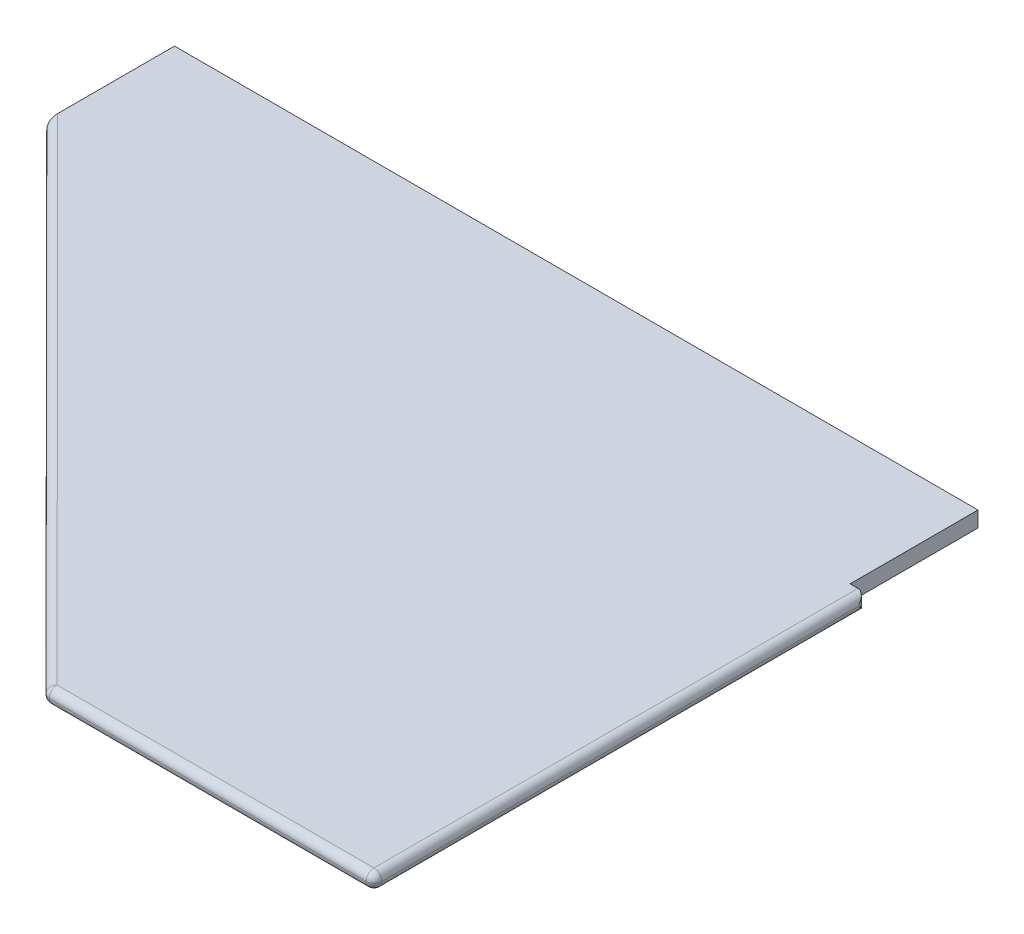
ISO-10303-21;
HEADER;
FILE_DESCRIPTION(('STEP AP214'),'2;1');
FILE_NAME('part.step','',(''),(''),'','','');
FILE_SCHEMA(('AUTOMOTIVE_DESIGN { 1 0 10303 214 1 1 1 1 }'));
ENDSEC;
DATA;
#1=APPLICATION_CONTEXT('core data for automotive mechanical design processes');
#2=APPLICATION_PROTOCOL_DEFINITION('international standard','automotive_design',2000,#1);
#3=PRODUCT_CONTEXT('',#1,'mechanical');
#4=PRODUCT('Part','Part','',(#3));
#5=PRODUCT_RELATED_PRODUCT_CATEGORY('part','',(#4));
#6=PRODUCT_DEFINITION_FORMATION('','',#4);
#7=PRODUCT_DEFINITION_CONTEXT('part definition',#1,'design');
#8=PRODUCT_DEFINITION('design','',#6,#7);
#9=PRODUCT_DEFINITION_SHAPE('','',#8);
#10=(LENGTH_UNIT() NAMED_UNIT(*) SI_UNIT(.MILLI.,.METRE.));
#11=(NAMED_UNIT(*) PLANE_ANGLE_UNIT() SI_UNIT($,.RADIAN.));
#12=(NAMED_UNIT(*) SI_UNIT($,.STERADIAN.) SOLID_ANGLE_UNIT());
#13=UNCERTAINTY_MEASURE_WITH_UNIT(LENGTH_MEASURE(1.E-05),#10,'distance_accuracy_value','');
#14=(GEOMETRIC_REPRESENTATION_CONTEXT(3) GLOBAL_UNCERTAINTY_ASSIGNED_CONTEXT((#13)) GLOBAL_UNIT_ASSIGNED_CONTEXT((#10,
#11,#12)) REPRESENTATION_CONTEXT('',''));
#15=CARTESIAN_POINT('',(0.,0.,0.));
#16=DIRECTION('',(0.,0.,1.));
#17=DIRECTION('',(1.,0.,0.));
#18=AXIS2_PLACEMENT_3D('',#15,#16,#17);
#19=CARTESIAN_POINT('',(0.,4.76,-150.));
#20=DIRECTION('',(0.,0.,1.));
#21=DIRECTION('',(1.,0.,0.));
#22=AXIS2_PLACEMENT_3D('',#19,#20,#21);
#23=PLANE('',#22);
#24=DIRECTION('',(-1.,0.,0.));
#25=VECTOR('',#24,1.);
#26=CARTESIAN_POINT('',(0.,4.76,-150.));
#27=LINE('',#26,#25);
#28=CARTESIAN_POINT('',(-2.38,4.76,-150.));
#29=VERTEX_POINT('',#28);
#30=CARTESIAN_POINT('',(-4.8006,4.76,-150.));
#31=VERTEX_POINT('',#30);
#32=EDGE_CURVE('E240',#29,#31,#27,.T.);
#33=ORIENTED_EDGE('',*,*,#32,.F.);
#34=DIRECTION('',(0.,-1.,0.));
#35=VECTOR('',#34,1.);
#36=CARTESIAN_POINT('',(-2.38,4.76,-150.));
#37=LINE('',#36,#35);
#38=CARTESIAN_POINT('',(-2.38,0.,-150.));
#39=VERTEX_POINT('',#38);
#40=EDGE_CURVE('E140',#29,#39,#37,.T.);
#41=ORIENTED_EDGE('',*,*,#40,.T.);
#42=DIRECTION('',(-1.,0.,0.));
#43=VECTOR('',#42,1.);
#44=CARTESIAN_POINT('',(0.,0.,-150.));
#45=LINE('',#44,#43);
#46=CARTESIAN_POINT('',(-4.8006,0.,-150.));
#47=VERTEX_POINT('',#46);
#48=EDGE_CURVE('E100',#39,#47,#45,.T.);
#49=ORIENTED_EDGE('',*,*,#48,.T.);
#50=DIRECTION('',(0.,-1.,0.));
#51=VECTOR('',#50,1.);
#52=CARTESIAN_POINT('',(-4.8006,4.76,-150.));
#53=LINE('',#52,#51);
#54=EDGE_CURVE('E249',#31,#47,#53,.T.);
#55=ORIENTED_EDGE('',*,*,#54,.F.);
#56=EDGE_LOOP('',(#33,#41,#49,#55));
#57=FACE_BOUND('',#56,.T.);
#58=ADVANCED_FACE('F45',(#57),#23,.F.);
#59=CARTESIAN_POINT('',(-4.8006,4.76,-150.));
#60=DIRECTION('',(-1.,0.,0.));
#61=DIRECTION('',(0.,0.,1.));
#62=AXIS2_PLACEMENT_3D('',#59,#60,#61);
#63=PLANE('',#62);
#64=DIRECTION('',(0.,0.,-1.));
#65=VECTOR('',#64,1.);
#66=CARTESIAN_POINT('',(-4.8006,0.,-150.));
#67=LINE('',#66,#65);
#68=CARTESIAN_POINT('',(-4.8006,0.,-188.989));
#69=VERTEX_POINT('',#68);
#70=EDGE_CURVE('E225',#47,#69,#67,.T.);
#71=ORIENTED_EDGE('',*,*,#70,.T.);
#72=DIRECTION('',(0.,-1.,0.));
#73=VECTOR('',#72,1.);
#74=CARTESIAN_POINT('',(-4.8006,4.76,-188.989));
#75=LINE('',#74,#73);
#76=CARTESIAN_POINT('',(-4.8006,4.76,-188.989));
#77=VERTEX_POINT('',#76);
#78=EDGE_CURVE('E245',#77,#69,#75,.T.);
#79=ORIENTED_EDGE('',*,*,#78,.F.);
#80=DIRECTION('',(0.,0.,-1.));
#81=VECTOR('',#80,1.);
#82=CARTESIAN_POINT('',(-4.8006,4.76,-150.));
#83=LINE('',#82,#81);
#84=EDGE_CURVE('E270',#31,#77,#83,.T.);
#85=ORIENTED_EDGE('',*,*,#84,.F.);
#86=ORIENTED_EDGE('',*,*,#54,.T.);
#87=EDGE_LOOP('',(#71,#79,#85,#86));
#88=FACE_BOUND('',#87,.T.);
#89=ADVANCED_FACE('F310',(#88),#63,.F.);
#90=CARTESIAN_POINT('',(-4.8006,4.76,-188.989));
#91=DIRECTION('',(0.,0.,1.));
#92=DIRECTION('',(1.,0.,0.));
#93=AXIS2_PLACEMENT_3D('',#90,#91,#92);
#94=PLANE('',#93);
#95=DIRECTION('',(-1.,0.,0.));
#96=VECTOR('',#95,1.);
#97=CARTESIAN_POINT('',(-4.8006,0.,-188.989));
#98=LINE('',#97,#96);
#99=CARTESIAN_POINT('',(-249.8006,0.,-188.989));
#100=VERTEX_POINT('',#99);
#101=EDGE_CURVE('E228',#69,#100,#98,.T.);
#102=ORIENTED_EDGE('',*,*,#101,.T.);
#103=DIRECTION('',(0.,-1.,0.));
#104=VECTOR('',#103,1.);
#105=CARTESIAN_POINT('',(-249.8006,4.76,-188.989));
#106=LINE('',#105,#104);
#107=CARTESIAN_POINT('',(-249.8006,4.76,-188.989));
#108=VERTEX_POINT('',#107);
#109=EDGE_CURVE('E241',#108,#100,#106,.T.);
#110=ORIENTED_EDGE('',*,*,#109,.F.);
#111=DIRECTION('',(-1.,0.,0.));
#112=VECTOR('',#111,1.);
#113=CARTESIAN_POINT('',(-4.8006,4.76,-188.989));
#114=LINE('',#113,#112);
#115=EDGE_CURVE('E304',#77,#108,#114,.T.);
#116=ORIENTED_EDGE('',*,*,#115,.F.);
#117=ORIENTED_EDGE('',*,*,#78,.T.);
#118=EDGE_LOOP('',(#102,#110,#116,#117));
#119=FACE_BOUND('',#118,.T.);
#120=ADVANCED_FACE('F301',(#119),#94,.F.);
#121=CARTESIAN_POINT('',(-249.8006,4.76,-188.989));
#122=DIRECTION('',(1.,0.,0.));
#123=DIRECTION('',(0.,0.,-1.));
#124=AXIS2_PLACEMENT_3D('',#121,#122,#123);
#125=PLANE('',#124);
#126=DIRECTION('',(0.,-1.,0.));
#127=VECTOR('',#126,1.);
#128=CARTESIAN_POINT('',(-249.8006,4.76,-150.984902060891));
#129=LINE('',#128,#127);
#130=CARTESIAN_POINT('',(-249.8006,0.698204429488853,-150.984902060891));
#131=VERTEX_POINT('',#130);
#132=CARTESIAN_POINT('',(-249.8006,4.06179557051116,-150.984902060891));
#133=VERTEX_POINT('',#132);
#134=EDGE_CURVE('E56',#131,#133,#129,.F.);
#135=ORIENTED_EDGE('',*,*,#134,.T.);
#136=CARTESIAN_POINT('',(-249.8006,2.38,-153.368066903802));
#137=DIRECTION('',(1.,0.,0.));
#138=DIRECTION('',(0.,0.,-1.));
#139=AXIS2_PLACEMENT_3D('',#136,#137,#138);
#140=ELLIPSE('',#139,3.36806690380236,2.38);
#141=CARTESIAN_POINT('',(-249.8006,4.76,-153.368066903802));
#142=VERTEX_POINT('',#141);
#143=EDGE_CURVE('E11',#133,#142,#140,.F.);
#144=ORIENTED_EDGE('',*,*,#143,.T.);
#145=DIRECTION('',(0.,0.,1.));
#146=VECTOR('',#145,1.);
#147=CARTESIAN_POINT('',(-249.8006,4.76,-188.989));
#148=LINE('',#147,#146);
#149=EDGE_CURVE('E231',#108,#142,#148,.T.);
#150=ORIENTED_EDGE('',*,*,#149,.F.);
#151=ORIENTED_EDGE('',*,*,#109,.T.);
#152=DIRECTION('',(0.,0.,1.));
#153=VECTOR('',#152,1.);
#154=CARTESIAN_POINT('',(-249.8006,0.,-188.989));
#155=LINE('',#154,#153);
#156=CARTESIAN_POINT('',(-249.8006,0.,-153.368066903802));
#157=VERTEX_POINT('',#156);
#158=EDGE_CURVE('E236',#100,#157,#155,.T.);
#159=ORIENTED_EDGE('',*,*,#158,.T.);
#160=CARTESIAN_POINT('',(-249.8006,2.38,-153.368066903802));
#161=DIRECTION('',(1.,0.,0.));
#162=DIRECTION('',(0.,0.,1.));
#163=AXIS2_PLACEMENT_3D('',#160,#161,#162);
#164=ELLIPSE('',#163,3.36806690380236,2.38);
#165=EDGE_CURVE('E175',#157,#131,#164,.F.);
#166=ORIENTED_EDGE('',*,*,#165,.T.);
#167=EDGE_LOOP('',(#135,#144,#150,#151,#159,#166));
#168=FACE_BOUND('',#167,.T.);
#169=ADVANCED_FACE('F295',(#168),#125,.F.);
#170=CARTESIAN_POINT('',(0.,4.76,0.));
#171=DIRECTION('',(0.,1.,0.));
#172=DIRECTION('',(0.,0.,1.));
#173=AXIS2_PLACEMENT_3D('',#170,#171,#172);
#174=PLANE('',#173);
#175=DIRECTION('',(1.,0.,0.));
#176=VECTOR('',#175,1.);
#177=CARTESIAN_POINT('',(0.,4.76,-2.38));
#178=LINE('',#177,#176);
#179=CARTESIAN_POINT('',(-99.0130452490459,4.76,-2.38));
#180=VERTEX_POINT('',#179);
#181=CARTESIAN_POINT('',(-2.38,4.76,-2.38));
#182=VERTEX_POINT('',#181);
#183=EDGE_CURVE('E255',#180,#182,#178,.T.);
#184=ORIENTED_EDGE('',*,*,#183,.T.);
#185=DIRECTION('',(0.,0.,-1.));
#186=VECTOR('',#185,1.);
#187=CARTESIAN_POINT('',(-2.38,4.76,-150.));
#188=LINE('',#187,#186);
#189=EDGE_CURVE('E169',#182,#29,#188,.T.);
#190=ORIENTED_EDGE('',*,*,#189,.T.);
#191=ORIENTED_EDGE('',*,*,#32,.T.);
#192=ORIENTED_EDGE('',*,*,#84,.T.);
#193=ORIENTED_EDGE('',*,*,#115,.T.);
#194=ORIENTED_EDGE('',*,*,#149,.T.);
#195=DIRECTION('',(0.706636794332413,0.,0.707576455865803));
#196=VECTOR('',#195,1.);
#197=CARTESIAN_POINT('',(-98.3157680350394,4.76,-1.68179557051115));
#198=LINE('',#197,#196);
#199=EDGE_CURVE('E252',#142,#180,#198,.T.);
#200=ORIENTED_EDGE('',*,*,#199,.T.);
#201=EDGE_LOOP('',(#184,#190,#191,#192,#193,#194,#200));
#202=FACE_BOUND('',#201,.T.);
#203=ADVANCED_FACE('F263',(#202),#174,.T.);
#204=CARTESIAN_POINT('',(0.,0.,0.));
#205=DIRECTION('',(0.,1.,0.));
#206=DIRECTION('',(0.,0.,1.));
#207=AXIS2_PLACEMENT_3D('',#204,#205,#206);
#208=PLANE('',#207);
#209=ORIENTED_EDGE('',*,*,#48,.F.);
#210=DIRECTION('',(0.,0.,-1.));
#211=VECTOR('',#210,1.);
#212=CARTESIAN_POINT('',(-2.38,0.,0.));
#213=LINE('',#212,#211);
#214=CARTESIAN_POINT('',(-2.38,0.,-2.38));
#215=VERTEX_POINT('',#214);
#216=EDGE_CURVE('E132',#39,#215,#213,.F.);
#217=ORIENTED_EDGE('',*,*,#216,.T.);
#218=DIRECTION('',(1.,0.,0.));
#219=VECTOR('',#218,1.);
#220=CARTESIAN_POINT('',(0.,0.,-2.38));
#221=LINE('',#220,#219);
#222=CARTESIAN_POINT('',(-99.0130452490459,0.,-2.38));
#223=VERTEX_POINT('',#222);
#224=EDGE_CURVE('E136',#215,#223,#221,.F.);
#225=ORIENTED_EDGE('',*,*,#224,.T.);
#226=DIRECTION('',(0.706636794332413,0.,0.707576455865803));
#227=VECTOR('',#226,1.);
#228=CARTESIAN_POINT('',(-48.3823119917123,0.,48.3180602813873));
#229=LINE('',#228,#227);
#230=EDGE_CURVE('E166',#223,#157,#229,.F.);
#231=ORIENTED_EDGE('',*,*,#230,.T.);
#232=ORIENTED_EDGE('',*,*,#158,.F.);
#233=ORIENTED_EDGE('',*,*,#101,.F.);
#234=ORIENTED_EDGE('',*,*,#70,.F.);
#235=EDGE_LOOP('',(#209,#217,#225,#231,#232,#233,#234));
#236=FACE_BOUND('',#235,.T.);
#237=ADVANCED_FACE('F134',(#236),#208,.F.);
#238=CARTESIAN_POINT('',(-248.116568035039,2.38,-151.681795570511));
#239=DIRECTION('',(0.706636794332413,0.,0.707576455865803));
#240=DIRECTION('',(0.707576455865803,0.,-0.706636794332413));
#241=AXIS2_PLACEMENT_3D('',#238,#239,#240);
#242=CYLINDRICAL_SURFACE('',#241,2.38);
#243=CARTESIAN_POINT('',(-247.4206,2.38,-150.984902060891));
#244=DIRECTION('',(0.499667669108373,-0.707106781186547,0.500332110150653));
#245=DIRECTION('',(0.499667669108373,0.707106781186547,0.500332110150653));
#246=AXIS2_PLACEMENT_3D('',#243,#244,#245);
#247=ELLIPSE('',#246,3.36582827844797,2.38);
#248=CARTESIAN_POINT('',(-249.104631964961,2.38,-149.30310649038));
#249=VERTEX_POINT('',#248);
#250=EDGE_CURVE('E49',#131,#249,#247,.F.);
#251=ORIENTED_EDGE('',*,*,#250,.F.);
#252=ORIENTED_EDGE('',*,*,#165,.F.);
#253=ORIENTED_EDGE('',*,*,#230,.F.);
#254=CARTESIAN_POINT('',(-99.0130452490459,2.38,-2.37999999999999));
#255=DIRECTION('',(0.706636794332413,0.,0.707576455865804));
#256=DIRECTION('',(0.707576455865804,0.,-0.706636794332413));
#257=AXIS2_PLACEMENT_3D('',#254,#255,#256);
#258=CIRCLE('',#257,2.38);
#259=CARTESIAN_POINT('',(-100.697077214006,2.38,-0.698204429488844));
#260=VERTEX_POINT('',#259);
#261=EDGE_CURVE('E150',#260,#223,#258,.T.);
#262=ORIENTED_EDGE('',*,*,#261,.F.);
#263=DIRECTION('',(0.706636794332413,0.,0.707576455865803));
#264=VECTOR('',#263,1.);
#265=CARTESIAN_POINT('',(-249.8006,2.38,-150.));
#266=LINE('',#265,#264);
#267=EDGE_CURVE('E212',#249,#260,#266,.T.);
#268=ORIENTED_EDGE('',*,*,#267,.F.);
#269=EDGE_LOOP('',(#251,#252,#253,#262,#268));
#270=FACE_BOUND('',#269,.T.);
#271=ADVANCED_FACE('F47',(#270),#242,.T.);
#272=CARTESIAN_POINT('',(-247.4206,4.76,-150.984902060891));
#273=DIRECTION('',(0.,-1.,0.));
#274=DIRECTION('',(0.,0.,-1.));
#275=AXIS2_PLACEMENT_3D('',#272,#273,#274);
#276=CYLINDRICAL_SURFACE('',#275,2.38);
#277=ORIENTED_EDGE('',*,*,#134,.F.);
#278=ORIENTED_EDGE('',*,*,#250,.T.);
#279=CARTESIAN_POINT('',(-247.4206,2.38,-150.984902060891));
#280=DIRECTION('',(-0.499667669108373,-0.707106781186547,-0.500332110150653));
#281=DIRECTION('',(-0.499667669108373,0.707106781186547,-0.500332110150653));
#282=AXIS2_PLACEMENT_3D('',#279,#280,#281);
#283=ELLIPSE('',#282,3.36582827844797,2.38);
#284=EDGE_CURVE('E208',#133,#249,#283,.F.);
#285=ORIENTED_EDGE('',*,*,#284,.F.);
#286=EDGE_LOOP('',(#277,#278,#285));
#287=FACE_BOUND('',#286,.T.);
#288=ADVANCED_FACE('F340',(#287),#276,.T.);
#289=CARTESIAN_POINT('',(-2.38,4.76,-147.62));
#290=DIRECTION('',(0.,-1.,0.));
#291=DIRECTION('',(0.,0.,-1.));
#292=AXIS2_PLACEMENT_3D('',#289,#290,#291);
#293=CYLINDRICAL_SURFACE('',#292,2.38);
#294=CARTESIAN_POINT('',(-2.38,2.38,-147.62));
#295=DIRECTION('',(0.,0.707106781186547,-0.707106781186547));
#296=DIRECTION('',(0.,-0.707106781186547,-0.707106781186547));
#297=AXIS2_PLACEMENT_3D('',#294,#295,#296);
#298=ELLIPSE('',#297,3.36582827844797,2.38);
#299=CARTESIAN_POINT('',(0.,2.38,-147.62));
#300=VERTEX_POINT('',#299);
#301=EDGE_CURVE('E86',#39,#300,#298,.F.);
#302=ORIENTED_EDGE('',*,*,#301,.F.);
#303=ORIENTED_EDGE('',*,*,#40,.F.);
#304=CARTESIAN_POINT('',(-2.38,2.38,-147.62));
#305=DIRECTION('',(0.,-0.707106781186547,-0.707106781186547));
#306=DIRECTION('',(0.,-0.707106781186547,0.707106781186547));
#307=AXIS2_PLACEMENT_3D('',#304,#305,#306);
#308=ELLIPSE('',#307,3.36582827844797,2.38);
#309=EDGE_CURVE('E204',#300,#29,#308,.F.);
#310=ORIENTED_EDGE('',*,*,#309,.F.);
#311=EDGE_LOOP('',(#302,#303,#310));
#312=FACE_BOUND('',#311,.T.);
#313=ADVANCED_FACE('F273',(#312),#293,.T.);
#314=CARTESIAN_POINT('',(-2.38,2.38,0.));
#315=DIRECTION('',(0.,0.,-1.));
#316=DIRECTION('',(-1.,0.,0.));
#317=AXIS2_PLACEMENT_3D('',#314,#315,#316);
#318=CYLINDRICAL_SURFACE('',#317,2.38);
#319=CARTESIAN_POINT('',(-2.38,2.38,-2.38));
#320=DIRECTION('',(0.,0.,1.));
#321=DIRECTION('',(1.,0.,0.));
#322=AXIS2_PLACEMENT_3D('',#319,#320,#321);
#323=CIRCLE('',#322,2.38);
#324=CARTESIAN_POINT('',(0.,2.38,-2.38));
#325=VERTEX_POINT('',#324);
#326=EDGE_CURVE('E142',#215,#325,#323,.T.);
#327=ORIENTED_EDGE('',*,*,#326,.F.);
#328=ORIENTED_EDGE('',*,*,#216,.F.);
#329=ORIENTED_EDGE('',*,*,#301,.T.);
#330=DIRECTION('',(0.,0.,-1.));
#331=VECTOR('',#330,1.);
#332=CARTESIAN_POINT('',(0.,2.38,0.));
#333=LINE('',#332,#331);
#334=EDGE_CURVE('E146',#325,#300,#333,.T.);
#335=ORIENTED_EDGE('',*,*,#334,.F.);
#336=EDGE_LOOP('',(#327,#328,#329,#335));
#337=FACE_BOUND('',#336,.T.);
#338=ADVANCED_FACE('F144',(#337),#318,.T.);
#339=CARTESIAN_POINT('',(-2.38,2.38,-2.38));
#340=DIRECTION('',(1.,0.,0.));
#341=DIRECTION('',(0.,0.,-1.));
#342=AXIS2_PLACEMENT_3D('',#339,#340,#341);
#343=SPHERICAL_SURFACE('',#342,2.38);
#344=CARTESIAN_POINT('',(-2.38,2.38,-2.38));
#345=DIRECTION('',(1.,0.,0.));
#346=DIRECTION('',(0.,0.,-1.));
#347=AXIS2_PLACEMENT_3D('',#344,#345,#346);
#348=CIRCLE('',#347,2.38);
#349=CARTESIAN_POINT('',(-2.38,2.38,0.));
#350=VERTEX_POINT('',#349);
#351=EDGE_CURVE('E153',#215,#350,#348,.F.);
#352=ORIENTED_EDGE('',*,*,#351,.F.);
#353=ORIENTED_EDGE('',*,*,#326,.T.);
#354=CARTESIAN_POINT('',(-2.38,2.38,-2.38));
#355=DIRECTION('',(0.,-1.,0.));
#356=DIRECTION('',(0.,0.,-1.));
#357=AXIS2_PLACEMENT_3D('',#354,#355,#356);
#358=CIRCLE('',#357,2.38);
#359=EDGE_CURVE('E156',#350,#325,#358,.F.);
#360=ORIENTED_EDGE('',*,*,#359,.F.);
#361=EDGE_LOOP('',(#352,#353,#360));
#362=FACE_BOUND('',#361,.T.);
#363=ADVANCED_FACE('F154',(#362),#343,.T.);
#364=CARTESIAN_POINT('',(-99.0130452490459,2.38,-2.38));
#365=DIRECTION('',(0.,-1.,0.));
#366=DIRECTION('',(1.,0.,0.));
#367=AXIS2_PLACEMENT_3D('',#364,#365,#366);
#368=SPHERICAL_SURFACE('',#367,2.38);
#369=CARTESIAN_POINT('',(-99.0130452490459,2.38,-2.38));
#370=DIRECTION('',(0.,-1.,0.));
#371=DIRECTION('',(0.,0.,-1.));
#372=AXIS2_PLACEMENT_3D('',#369,#370,#371);
#373=CIRCLE('',#372,2.38);
#374=CARTESIAN_POINT('',(-99.0130452490459,2.38,0.));
#375=VERTEX_POINT('',#374);
#376=EDGE_CURVE('E216',#260,#375,#373,.F.);
#377=ORIENTED_EDGE('',*,*,#376,.F.);
#378=ORIENTED_EDGE('',*,*,#261,.T.);
#379=CARTESIAN_POINT('',(-99.0130452490459,2.38,-2.38));
#380=DIRECTION('',(-1.,0.,0.));
#381=DIRECTION('',(0.,0.,1.));
#382=AXIS2_PLACEMENT_3D('',#379,#380,#381);
#383=CIRCLE('',#382,2.38);
#384=EDGE_CURVE('E161',#375,#223,#383,.F.);
#385=ORIENTED_EDGE('',*,*,#384,.F.);
#386=EDGE_LOOP('',(#377,#378,#385));
#387=FACE_BOUND('',#386,.T.);
#388=ADVANCED_FACE('F286',(#387),#368,.T.);
#389=CARTESIAN_POINT('',(-48.3823119917123,2.38,48.3180602813873));
#390=DIRECTION('',(-0.706636794332413,0.,-0.707576455865803));
#391=DIRECTION('',(-0.707576455865803,0.,0.706636794332413));
#392=AXIS2_PLACEMENT_3D('',#389,#390,#391);
#393=CYLINDRICAL_SURFACE('',#392,2.38);
#394=ORIENTED_EDGE('',*,*,#284,.T.);
#395=ORIENTED_EDGE('',*,*,#267,.T.);
#396=CARTESIAN_POINT('',(-99.0130452490459,2.38,-2.38));
#397=DIRECTION('',(0.706636794332418,0.,0.707576455865798));
#398=DIRECTION('',(0.707576455865798,0.,-0.706636794332418));
#399=AXIS2_PLACEMENT_3D('',#396,#397,#398);
#400=CIRCLE('',#399,2.38);
#401=EDGE_CURVE('E194',#180,#260,#400,.T.);
#402=ORIENTED_EDGE('',*,*,#401,.F.);
#403=ORIENTED_EDGE('',*,*,#199,.F.);
#404=ORIENTED_EDGE('',*,*,#143,.F.);
#405=EDGE_LOOP('',(#394,#395,#402,#403,#404));
#406=FACE_BOUND('',#405,.T.);
#407=ADVANCED_FACE('F288',(#406),#393,.T.);
#408=CARTESIAN_POINT('',(-2.38,2.38,0.));
#409=DIRECTION('',(0.,0.,1.));
#410=DIRECTION('',(1.,0.,0.));
#411=AXIS2_PLACEMENT_3D('',#408,#409,#410);
#412=CYLINDRICAL_SURFACE('',#411,2.38);
#413=ORIENTED_EDGE('',*,*,#309,.T.);
#414=ORIENTED_EDGE('',*,*,#189,.F.);
#415=CARTESIAN_POINT('',(-2.38,2.38,-2.38));
#416=DIRECTION('',(0.,0.,1.));
#417=DIRECTION('',(1.,0.,0.));
#418=AXIS2_PLACEMENT_3D('',#415,#416,#417);
#419=CIRCLE('',#418,2.38);
#420=EDGE_CURVE('E190',#325,#182,#419,.T.);
#421=ORIENTED_EDGE('',*,*,#420,.F.);
#422=ORIENTED_EDGE('',*,*,#334,.T.);
#423=EDGE_LOOP('',(#413,#414,#421,#422));
#424=FACE_BOUND('',#423,.T.);
#425=ADVANCED_FACE('F274',(#424),#412,.T.);
#426=CARTESIAN_POINT('',(-99.9998,2.38,-2.38));
#427=DIRECTION('',(1.,0.,0.));
#428=DIRECTION('',(0.,0.,-1.));
#429=AXIS2_PLACEMENT_3D('',#426,#427,#428);
#430=CYLINDRICAL_SURFACE('',#429,2.38);
#431=ORIENTED_EDGE('',*,*,#224,.F.);
#432=ORIENTED_EDGE('',*,*,#351,.T.);
#433=DIRECTION('',(1.,0.,0.));
#434=VECTOR('',#433,1.);
#435=CARTESIAN_POINT('',(-99.9998,2.38,0.));
#436=LINE('',#435,#434);
#437=EDGE_CURVE('E187',#375,#350,#436,.T.);
#438=ORIENTED_EDGE('',*,*,#437,.F.);
#439=ORIENTED_EDGE('',*,*,#384,.T.);
#440=EDGE_LOOP('',(#431,#432,#438,#439));
#441=FACE_BOUND('',#440,.T.);
#442=ADVANCED_FACE('F164',(#441),#430,.T.);
#443=CARTESIAN_POINT('',(-99.0130452490459,2.38,-2.38));
#444=DIRECTION('',(0.,1.,0.));
#445=DIRECTION('',(0.,0.,1.));
#446=AXIS2_PLACEMENT_3D('',#443,#444,#445);
#447=SPHERICAL_SURFACE('',#446,2.38);
#448=ORIENTED_EDGE('',*,*,#401,.T.);
#449=ORIENTED_EDGE('',*,*,#376,.T.);
#450=CARTESIAN_POINT('',(-99.0130452490459,2.38,-2.38));
#451=DIRECTION('',(-1.,0.,0.));
#452=DIRECTION('',(0.,-1.,0.));
#453=AXIS2_PLACEMENT_3D('',#450,#451,#452);
#454=CIRCLE('',#453,2.38);
#455=EDGE_CURVE('E183',#180,#375,#454,.F.);
#456=ORIENTED_EDGE('',*,*,#455,.F.);
#457=EDGE_LOOP('',(#448,#449,#456));
#458=FACE_BOUND('',#457,.T.);
#459=ADVANCED_FACE('F282',(#458),#447,.T.);
#460=CARTESIAN_POINT('',(-2.38,2.38,-2.38));
#461=DIRECTION('',(1.,0.,0.));
#462=DIRECTION('',(0.,0.,-1.));
#463=AXIS2_PLACEMENT_3D('',#460,#461,#462);
#464=SPHERICAL_SURFACE('',#463,2.38);
#465=ORIENTED_EDGE('',*,*,#359,.T.);
#466=ORIENTED_EDGE('',*,*,#420,.T.);
#467=CARTESIAN_POINT('',(-2.38,2.38,-2.38));
#468=DIRECTION('',(1.,0.,0.));
#469=DIRECTION('',(0.,0.,-1.));
#470=AXIS2_PLACEMENT_3D('',#467,#468,#469);
#471=CIRCLE('',#470,2.38);
#472=EDGE_CURVE('E180',#350,#182,#471,.F.);
#473=ORIENTED_EDGE('',*,*,#472,.F.);
#474=EDGE_LOOP('',(#465,#466,#473));
#475=FACE_BOUND('',#474,.T.);
#476=ADVANCED_FACE('F277',(#475),#464,.T.);
#477=CARTESIAN_POINT('',(0.,2.38,-2.38));
#478=DIRECTION('',(-1.,0.,0.));
#479=DIRECTION('',(0.,0.,1.));
#480=AXIS2_PLACEMENT_3D('',#477,#478,#479);
#481=CYLINDRICAL_SURFACE('',#480,2.38);
#482=ORIENTED_EDGE('',*,*,#455,.T.);
#483=ORIENTED_EDGE('',*,*,#437,.T.);
#484=ORIENTED_EDGE('',*,*,#472,.T.);
#485=ORIENTED_EDGE('',*,*,#183,.F.);
#486=EDGE_LOOP('',(#482,#483,#484,#485));
#487=FACE_BOUND('',#486,.T.);
#488=ADVANCED_FACE('F279',(#487),#481,.T.);
#489=CLOSED_SHELL('',(#58,#89,#120,#169,#203,#237,#271,#288,#313,#338,#363,#388,#407,#425,#442,
#459,#476,#488));
#490=MANIFOLD_SOLID_BREP('B2',#489);
#491=ADVANCED_BREP_SHAPE_REPRESENTATION('',(#18,#490),#14);
#492=SHAPE_DEFINITION_REPRESENTATION(#9,#491);
ENDSEC;
END-ISO-10303-21;
